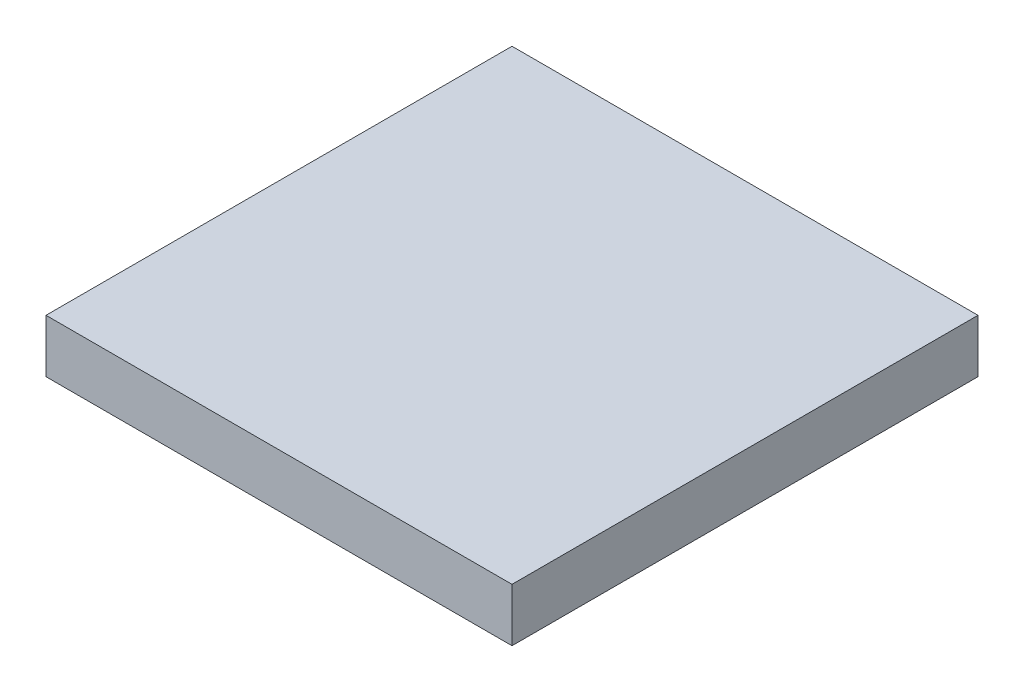
ISO-10303-21;
HEADER;
FILE_DESCRIPTION(('STEP AP214'),'2;1');
FILE_NAME('part.step','',(''),(''),'','','');
FILE_SCHEMA(('AUTOMOTIVE_DESIGN { 1 0 10303 214 1 1 1 1 }'));
ENDSEC;
DATA;
#1=APPLICATION_CONTEXT('core data for automotive mechanical design processes');
#2=APPLICATION_PROTOCOL_DEFINITION('international standard','automotive_design',2000,#1);
#3=PRODUCT_CONTEXT('',#1,'mechanical');
#4=PRODUCT('Part','Part','',(#3));
#5=PRODUCT_RELATED_PRODUCT_CATEGORY('part','',(#4));
#6=PRODUCT_DEFINITION_FORMATION('','',#4);
#7=PRODUCT_DEFINITION_CONTEXT('part definition',#1,'design');
#8=PRODUCT_DEFINITION('design','',#6,#7);
#9=PRODUCT_DEFINITION_SHAPE('','',#8);
#10=(LENGTH_UNIT() NAMED_UNIT(*) SI_UNIT(.MILLI.,.METRE.));
#11=(NAMED_UNIT(*) PLANE_ANGLE_UNIT() SI_UNIT($,.RADIAN.));
#12=(NAMED_UNIT(*) SI_UNIT($,.STERADIAN.) SOLID_ANGLE_UNIT());
#13=UNCERTAINTY_MEASURE_WITH_UNIT(LENGTH_MEASURE(1.E-05),#10,'distance_accuracy_value','');
#14=(GEOMETRIC_REPRESENTATION_CONTEXT(3) GLOBAL_UNCERTAINTY_ASSIGNED_CONTEXT((#13)) GLOBAL_UNIT_ASSIGNED_CONTEXT((#10,
#11,#12)) REPRESENTATION_CONTEXT('',''));
#15=CARTESIAN_POINT('',(0.,0.,0.));
#16=DIRECTION('',(0.,0.,1.));
#17=DIRECTION('',(1.,0.,0.));
#18=AXIS2_PLACEMENT_3D('',#15,#16,#17);
#19=CARTESIAN_POINT('',(0.,5.08,0.));
#20=DIRECTION('',(1.,0.,0.));
#21=DIRECTION('',(0.,0.,-1.));
#22=AXIS2_PLACEMENT_3D('',#19,#20,#21);
#23=PLANE('',#22);
#24=DIRECTION('',(0.,0.,1.));
#25=VECTOR('',#24,1.);
#26=CARTESIAN_POINT('',(0.,0.,0.));
#27=LINE('',#26,#25);
#28=CARTESIAN_POINT('',(0.,0.,-44.5));
#29=VERTEX_POINT('',#28);
#30=CARTESIAN_POINT('',(0.,0.,0.));
#31=VERTEX_POINT('',#30);
#32=EDGE_CURVE('E96',#29,#31,#27,.T.);
#33=ORIENTED_EDGE('',*,*,#32,.T.);
#34=DIRECTION('',(0.,-1.,0.));
#35=VECTOR('',#34,1.);
#36=CARTESIAN_POINT('',(0.,5.08,0.));
#37=LINE('',#36,#35);
#38=CARTESIAN_POINT('',(0.,5.08,0.));
#39=VERTEX_POINT('',#38);
#40=EDGE_CURVE('E11',#39,#31,#37,.T.);
#41=ORIENTED_EDGE('',*,*,#40,.F.);
#42=DIRECTION('',(0.,0.,1.));
#43=VECTOR('',#42,1.);
#44=CARTESIAN_POINT('',(0.,5.08,0.));
#45=LINE('',#44,#43);
#46=CARTESIAN_POINT('',(0.,5.08,-44.5));
#47=VERTEX_POINT('',#46);
#48=EDGE_CURVE('E84',#47,#39,#45,.T.);
#49=ORIENTED_EDGE('',*,*,#48,.F.);
#50=DIRECTION('',(0.,-1.,0.));
#51=VECTOR('',#50,1.);
#52=CARTESIAN_POINT('',(0.,5.08,-44.5));
#53=LINE('',#52,#51);
#54=EDGE_CURVE('E92',#47,#29,#53,.T.);
#55=ORIENTED_EDGE('',*,*,#54,.T.);
#56=EDGE_LOOP('',(#33,#41,#49,#55));
#57=FACE_BOUND('',#56,.T.);
#58=ADVANCED_FACE('F33',(#57),#23,.F.);
#59=CARTESIAN_POINT('',(0.,5.08,0.));
#60=DIRECTION('',(0.,0.,-1.));
#61=DIRECTION('',(-1.,0.,0.));
#62=AXIS2_PLACEMENT_3D('',#59,#60,#61);
#63=PLANE('',#62);
#64=DIRECTION('',(1.,0.,0.));
#65=VECTOR('',#64,1.);
#66=CARTESIAN_POINT('',(0.,0.,0.));
#67=LINE('',#66,#65);
#68=CARTESIAN_POINT('',(44.5,0.,0.));
#69=VERTEX_POINT('',#68);
#70=EDGE_CURVE('E88',#31,#69,#67,.T.);
#71=ORIENTED_EDGE('',*,*,#70,.T.);
#72=DIRECTION('',(0.,-1.,0.));
#73=VECTOR('',#72,1.);
#74=CARTESIAN_POINT('',(44.5,5.08,0.));
#75=LINE('',#74,#73);
#76=CARTESIAN_POINT('',(44.5,5.08,0.));
#77=VERTEX_POINT('',#76);
#78=EDGE_CURVE('E41',#77,#69,#75,.T.);
#79=ORIENTED_EDGE('',*,*,#78,.F.);
#80=DIRECTION('',(1.,0.,0.));
#81=VECTOR('',#80,1.);
#82=CARTESIAN_POINT('',(0.,5.08,0.));
#83=LINE('',#82,#81);
#84=EDGE_CURVE('E79',#39,#77,#83,.T.);
#85=ORIENTED_EDGE('',*,*,#84,.F.);
#86=ORIENTED_EDGE('',*,*,#40,.T.);
#87=EDGE_LOOP('',(#71,#79,#85,#86));
#88=FACE_BOUND('',#87,.T.);
#89=ADVANCED_FACE('F87',(#88),#63,.F.);
#90=CARTESIAN_POINT('',(44.5,5.08,0.));
#91=DIRECTION('',(-1.,0.,0.));
#92=DIRECTION('',(0.,0.,1.));
#93=AXIS2_PLACEMENT_3D('',#90,#91,#92);
#94=PLANE('',#93);
#95=DIRECTION('',(0.,0.,-1.));
#96=VECTOR('',#95,1.);
#97=CARTESIAN_POINT('',(44.5,0.,0.));
#98=LINE('',#97,#96);
#99=CARTESIAN_POINT('',(44.5,0.,-44.5));
#100=VERTEX_POINT('',#99);
#101=EDGE_CURVE('E66',#69,#100,#98,.T.);
#102=ORIENTED_EDGE('',*,*,#101,.T.);
#103=DIRECTION('',(0.,-1.,0.));
#104=VECTOR('',#103,1.);
#105=CARTESIAN_POINT('',(44.5,5.08,-44.5));
#106=LINE('',#105,#104);
#107=CARTESIAN_POINT('',(44.5,5.08,-44.5));
#108=VERTEX_POINT('',#107);
#109=EDGE_CURVE('E89',#108,#100,#106,.T.);
#110=ORIENTED_EDGE('',*,*,#109,.F.);
#111=DIRECTION('',(0.,0.,-1.));
#112=VECTOR('',#111,1.);
#113=CARTESIAN_POINT('',(44.5,5.08,0.));
#114=LINE('',#113,#112);
#115=EDGE_CURVE('E82',#77,#108,#114,.T.);
#116=ORIENTED_EDGE('',*,*,#115,.F.);
#117=ORIENTED_EDGE('',*,*,#78,.T.);
#118=EDGE_LOOP('',(#102,#110,#116,#117));
#119=FACE_BOUND('',#118,.T.);
#120=ADVANCED_FACE('F90',(#119),#94,.F.);
#121=CARTESIAN_POINT('',(0.,5.08,-44.5));
#122=DIRECTION('',(0.,0.,1.));
#123=DIRECTION('',(1.,0.,0.));
#124=AXIS2_PLACEMENT_3D('',#121,#122,#123);
#125=PLANE('',#124);
#126=DIRECTION('',(-1.,0.,0.));
#127=VECTOR('',#126,1.);
#128=CARTESIAN_POINT('',(0.,0.,-44.5));
#129=LINE('',#128,#127);
#130=EDGE_CURVE('E72',#100,#29,#129,.T.);
#131=ORIENTED_EDGE('',*,*,#130,.T.);
#132=ORIENTED_EDGE('',*,*,#54,.F.);
#133=DIRECTION('',(-1.,0.,0.));
#134=VECTOR('',#133,1.);
#135=CARTESIAN_POINT('',(0.,5.08,-44.5));
#136=LINE('',#135,#134);
#137=EDGE_CURVE('E49',#108,#47,#136,.T.);
#138=ORIENTED_EDGE('',*,*,#137,.F.);
#139=ORIENTED_EDGE('',*,*,#109,.T.);
#140=EDGE_LOOP('',(#131,#132,#138,#139));
#141=FACE_BOUND('',#140,.T.);
#142=ADVANCED_FACE('F103',(#141),#125,.F.);
#143=CARTESIAN_POINT('',(0.,5.08,0.));
#144=DIRECTION('',(0.,-1.,0.));
#145=DIRECTION('',(0.,0.,-1.));
#146=AXIS2_PLACEMENT_3D('',#143,#144,#145);
#147=PLANE('',#146);
#148=ORIENTED_EDGE('',*,*,#48,.T.);
#149=ORIENTED_EDGE('',*,*,#84,.T.);
#150=ORIENTED_EDGE('',*,*,#115,.T.);
#151=ORIENTED_EDGE('',*,*,#137,.T.);
#152=EDGE_LOOP('',(#148,#149,#150,#151));
#153=FACE_BOUND('',#152,.T.);
#154=ADVANCED_FACE('F80',(#153),#147,.F.);
#155=CARTESIAN_POINT('',(0.,0.,0.));
#156=DIRECTION('',(0.,-1.,0.));
#157=DIRECTION('',(0.,0.,-1.));
#158=AXIS2_PLACEMENT_3D('',#155,#156,#157);
#159=PLANE('',#158);
#160=ORIENTED_EDGE('',*,*,#32,.F.);
#161=ORIENTED_EDGE('',*,*,#130,.F.);
#162=ORIENTED_EDGE('',*,*,#101,.F.);
#163=ORIENTED_EDGE('',*,*,#70,.F.);
#164=EDGE_LOOP('',(#160,#161,#162,#163));
#165=FACE_BOUND('',#164,.T.);
#166=ADVANCED_FACE('F106',(#165),#159,.T.);
#167=CLOSED_SHELL('',(#58,#89,#120,#142,#154,#166));
#168=MANIFOLD_SOLID_BREP('B2',#167);
#169=ADVANCED_BREP_SHAPE_REPRESENTATION('',(#18,#168),#14);
#170=SHAPE_DEFINITION_REPRESENTATION(#9,#169);
ENDSEC;
END-ISO-10303-21;
